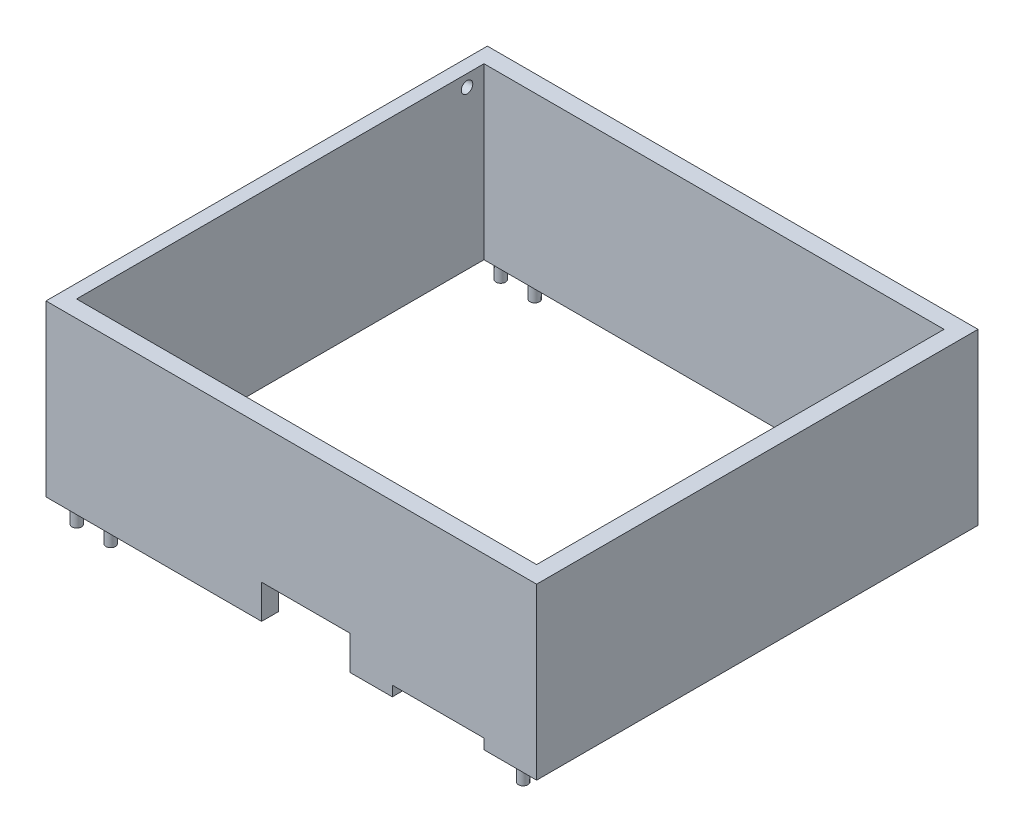
ISO-10303-21;
HEADER;
FILE_DESCRIPTION(('STEP AP214'),'2;1');
FILE_NAME('part.step','',(''),(''),'','','');
FILE_SCHEMA(('AUTOMOTIVE_DESIGN { 1 0 10303 214 1 1 1 1 }'));
ENDSEC;
DATA;
#1=APPLICATION_CONTEXT('core data for automotive mechanical design processes');
#2=APPLICATION_PROTOCOL_DEFINITION('international standard','automotive_design',2000,#1);
#3=PRODUCT_CONTEXT('',#1,'mechanical');
#4=PRODUCT('Part','Part','',(#3));
#5=PRODUCT_RELATED_PRODUCT_CATEGORY('part','',(#4));
#6=PRODUCT_DEFINITION_FORMATION('','',#4);
#7=PRODUCT_DEFINITION_CONTEXT('part definition',#1,'design');
#8=PRODUCT_DEFINITION('design','',#6,#7);
#9=PRODUCT_DEFINITION_SHAPE('','',#8);
#10=(LENGTH_UNIT() NAMED_UNIT(*) SI_UNIT(.MILLI.,.METRE.));
#11=(NAMED_UNIT(*) PLANE_ANGLE_UNIT() SI_UNIT($,.RADIAN.));
#12=(NAMED_UNIT(*) SI_UNIT($,.STERADIAN.) SOLID_ANGLE_UNIT());
#13=UNCERTAINTY_MEASURE_WITH_UNIT(LENGTH_MEASURE(1.E-05),#10,'distance_accuracy_value','');
#14=(GEOMETRIC_REPRESENTATION_CONTEXT(3) GLOBAL_UNCERTAINTY_ASSIGNED_CONTEXT((#13)) GLOBAL_UNIT_ASSIGNED_CONTEXT((#10,
#11,#12)) REPRESENTATION_CONTEXT('',''));
#15=CARTESIAN_POINT('',(0.,0.,0.));
#16=DIRECTION('',(0.,0.,1.));
#17=DIRECTION('',(1.,0.,0.));
#18=AXIS2_PLACEMENT_3D('',#15,#16,#17);
#19=CARTESIAN_POINT('',(0.,0.,0.));
#20=DIRECTION('',(0.,1.,0.));
#21=DIRECTION('',(0.,0.,1.));
#22=AXIS2_PLACEMENT_3D('',#19,#20,#21);
#23=PLANE('',#22);
#24=DIRECTION('',(1.,0.,0.));
#25=VECTOR('',#24,1.);
#26=CARTESIAN_POINT('',(72.25,0.,65.));
#27=LINE('',#26,#25);
#28=CARTESIAN_POINT('',(44.75,0.,65.));
#29=VERTEX_POINT('',#28);
#30=CARTESIAN_POINT('',(51.,0.,65.));
#31=VERTEX_POINT('',#30);
#32=EDGE_CURVE('E168',#29,#31,#27,.T.);
#33=ORIENTED_EDGE('',*,*,#32,.F.);
#34=DIRECTION('',(0.,0.,1.));
#35=VECTOR('',#34,1.);
#36=CARTESIAN_POINT('',(44.75,0.,48.5716117228159));
#37=LINE('',#36,#35);
#38=CARTESIAN_POINT('',(44.75,0.,62.5));
#39=VERTEX_POINT('',#38);
#40=EDGE_CURVE('E156',#39,#29,#37,.T.);
#41=ORIENTED_EDGE('',*,*,#40,.F.);
#42=DIRECTION('',(1.,0.,0.));
#43=VECTOR('',#42,1.);
#44=CARTESIAN_POINT('',(2.00000000000001,0.,62.5));
#45=LINE('',#44,#43);
#46=CARTESIAN_POINT('',(51.,0.,62.5));
#47=VERTEX_POINT('',#46);
#48=EDGE_CURVE('E166',#39,#47,#45,.T.);
#49=ORIENTED_EDGE('',*,*,#48,.T.);
#50=DIRECTION('',(0.,0.,1.));
#51=VECTOR('',#50,1.);
#52=CARTESIAN_POINT('',(51.,0.,48.5716117228159));
#53=LINE('',#52,#51);
#54=EDGE_CURVE('E54',#47,#31,#53,.T.);
#55=ORIENTED_EDGE('',*,*,#54,.T.);
#56=EDGE_LOOP('',(#33,#41,#49,#55));
#57=FACE_BOUND('',#56,.T.);
#58=ADVANCED_FACE('F39',(#57),#23,.F.);
#59=CARTESIAN_POINT('',(0.,25.,0.));
#60=DIRECTION('',(0.,1.,0.));
#61=DIRECTION('',(0.,0.,1.));
#62=AXIS2_PLACEMENT_3D('',#59,#60,#61);
#63=PLANE('',#62);
#64=DIRECTION('',(1.,0.,0.));
#65=VECTOR('',#64,1.);
#66=CARTESIAN_POINT('',(72.25,25.,65.));
#67=LINE('',#66,#65);
#68=CARTESIAN_POINT('',(0.,25.,65.));
#69=VERTEX_POINT('',#68);
#70=CARTESIAN_POINT('',(72.25,25.,65.));
#71=VERTEX_POINT('',#70);
#72=EDGE_CURVE('E203',#69,#71,#67,.T.);
#73=ORIENTED_EDGE('',*,*,#72,.T.);
#74=DIRECTION('',(0.,0.,-1.));
#75=VECTOR('',#74,1.);
#76=CARTESIAN_POINT('',(72.25,25.,0.));
#77=LINE('',#76,#75);
#78=CARTESIAN_POINT('',(72.25,25.,0.));
#79=VERTEX_POINT('',#78);
#80=EDGE_CURVE('E206',#71,#79,#77,.T.);
#81=ORIENTED_EDGE('',*,*,#80,.T.);
#82=DIRECTION('',(-1.,0.,0.));
#83=VECTOR('',#82,1.);
#84=CARTESIAN_POINT('',(0.,25.,0.));
#85=LINE('',#84,#83);
#86=CARTESIAN_POINT('',(0.,25.,0.));
#87=VERTEX_POINT('',#86);
#88=EDGE_CURVE('E209',#79,#87,#85,.T.);
#89=ORIENTED_EDGE('',*,*,#88,.T.);
#90=DIRECTION('',(0.,0.,1.));
#91=VECTOR('',#90,1.);
#92=CARTESIAN_POINT('',(0.,25.,0.));
#93=LINE('',#92,#91);
#94=EDGE_CURVE('E211',#87,#69,#93,.T.);
#95=ORIENTED_EDGE('',*,*,#94,.T.);
#96=EDGE_LOOP('',(#73,#81,#89,#95));
#97=FACE_BOUND('',#96,.T.);
#98=DIRECTION('',(0.,0.,-1.));
#99=VECTOR('',#98,1.);
#100=CARTESIAN_POINT('',(69.75,25.,2.5));
#101=LINE('',#100,#99);
#102=CARTESIAN_POINT('',(69.75,25.,62.5));
#103=VERTEX_POINT('',#102);
#104=CARTESIAN_POINT('',(69.75,25.,2.5));
#105=VERTEX_POINT('',#104);
#106=EDGE_CURVE('E280',#103,#105,#101,.T.);
#107=ORIENTED_EDGE('',*,*,#106,.F.);
#108=DIRECTION('',(1.,0.,0.));
#109=VECTOR('',#108,1.);
#110=CARTESIAN_POINT('',(2.00000000000001,25.,62.5));
#111=LINE('',#110,#109);
#112=CARTESIAN_POINT('',(2.00000000000001,25.,62.5));
#113=VERTEX_POINT('',#112);
#114=EDGE_CURVE('E191',#113,#103,#111,.T.);
#115=ORIENTED_EDGE('',*,*,#114,.F.);
#116=DIRECTION('',(0.,0.,1.));
#117=VECTOR('',#116,1.);
#118=CARTESIAN_POINT('',(2.,25.,2.5));
#119=LINE('',#118,#117);
#120=CARTESIAN_POINT('',(2.,25.,2.5));
#121=VERTEX_POINT('',#120);
#122=EDGE_CURVE('E181',#121,#113,#119,.T.);
#123=ORIENTED_EDGE('',*,*,#122,.F.);
#124=DIRECTION('',(-1.,0.,0.));
#125=VECTOR('',#124,1.);
#126=CARTESIAN_POINT('',(2.,25.,2.5));
#127=LINE('',#126,#125);
#128=EDGE_CURVE('E279',#105,#121,#127,.T.);
#129=ORIENTED_EDGE('',*,*,#128,.F.);
#130=EDGE_LOOP('',(#107,#115,#123,#129));
#131=FACE_BOUND('',#130,.T.);
#132=ADVANCED_FACE('F255',(#97,#131),#63,.T.);
#133=CARTESIAN_POINT('',(64.,0.,1.27793081581729));
#134=DIRECTION('',(0.,1.,0.));
#135=DIRECTION('',(0.,0.,1.));
#136=AXIS2_PLACEMENT_3D('',#133,#134,#135);
#137=CIRCLE('',#136,0.700000000000002);
#138=CARTESIAN_POINT('',(64.,0.,1.97793081581729));
#139=VERTEX_POINT('',#138);
#140=EDGE_CURVE('E11',#139,#139,#137,.F.);
#141=ORIENTED_EDGE('',*,*,#140,.F.);
#142=EDGE_LOOP('',(#141));
#143=FACE_BOUND('',#142,.T.);
#144=CARTESIAN_POINT('',(69.,0.,1.27793081581729));
#145=DIRECTION('',(0.,1.,0.));
#146=DIRECTION('',(0.,0.,1.));
#147=AXIS2_PLACEMENT_3D('',#144,#145,#146);
#148=CIRCLE('',#147,0.700000000000002);
#149=CARTESIAN_POINT('',(69.,0.,1.97793081581729));
#150=VERTEX_POINT('',#149);
#151=EDGE_CURVE('E47',#150,#150,#148,.F.);
#152=ORIENTED_EDGE('',*,*,#151,.F.);
#153=EDGE_LOOP('',(#152));
#154=FACE_BOUND('',#153,.T.);
#155=CARTESIAN_POINT('',(69.,0.,63.7220691841827));
#156=DIRECTION('',(0.,1.,0.));
#157=DIRECTION('',(0.,0.,1.));
#158=AXIS2_PLACEMENT_3D('',#155,#156,#157);
#159=CIRCLE('',#158,0.700000000000003);
#160=CARTESIAN_POINT('',(69.,0.,64.4220691841827));
#161=VERTEX_POINT('',#160);
#162=EDGE_CURVE('E245',#161,#161,#159,.F.);
#163=ORIENTED_EDGE('',*,*,#162,.F.);
#164=EDGE_LOOP('',(#163));
#165=FACE_BOUND('',#164,.T.);
#166=CARTESIAN_POINT('',(8.25000000000002,0.,1.27793081581729));
#167=DIRECTION('',(0.,1.,0.));
#168=DIRECTION('',(0.,0.,1.));
#169=AXIS2_PLACEMENT_3D('',#166,#167,#168);
#170=CIRCLE('',#169,0.7);
#171=CARTESIAN_POINT('',(8.25000000000002,0.,1.97793081581729));
#172=VERTEX_POINT('',#171);
#173=EDGE_CURVE('E242',#172,#172,#170,.F.);
#174=ORIENTED_EDGE('',*,*,#173,.F.);
#175=EDGE_LOOP('',(#174));
#176=FACE_BOUND('',#175,.T.);
#177=CARTESIAN_POINT('',(3.25000000000002,0.,1.27793081581729));
#178=DIRECTION('',(0.,1.,0.));
#179=DIRECTION('',(0.,0.,1.));
#180=AXIS2_PLACEMENT_3D('',#177,#178,#179);
#181=CIRCLE('',#180,0.7);
#182=CARTESIAN_POINT('',(3.25000000000002,0.,1.97793081581729));
#183=VERTEX_POINT('',#182);
#184=EDGE_CURVE('E239',#183,#183,#181,.F.);
#185=ORIENTED_EDGE('',*,*,#184,.F.);
#186=EDGE_LOOP('',(#185));
#187=FACE_BOUND('',#186,.T.);
#188=CARTESIAN_POINT('',(8.25000000000002,0.,63.7220691841827));
#189=DIRECTION('',(0.,1.,0.));
#190=DIRECTION('',(0.,0.,1.));
#191=AXIS2_PLACEMENT_3D('',#188,#189,#190);
#192=CIRCLE('',#191,0.700000000000001);
#193=CARTESIAN_POINT('',(8.25000000000002,0.,64.4220691841827));
#194=VERTEX_POINT('',#193);
#195=EDGE_CURVE('E236',#194,#194,#192,.F.);
#196=ORIENTED_EDGE('',*,*,#195,.F.);
#197=EDGE_LOOP('',(#196));
#198=FACE_BOUND('',#197,.T.);
#199=CARTESIAN_POINT('',(3.25000000000002,0.,63.7220691841827));
#200=DIRECTION('',(0.,1.,0.));
#201=DIRECTION('',(0.,0.,1.));
#202=AXIS2_PLACEMENT_3D('',#199,#200,#201);
#203=CIRCLE('',#202,0.700000000000001);
#204=CARTESIAN_POINT('',(3.25000000000002,0.,64.4220691841827));
#205=VERTEX_POINT('',#204);
#206=EDGE_CURVE('E233',#205,#205,#203,.F.);
#207=ORIENTED_EDGE('',*,*,#206,.F.);
#208=EDGE_LOOP('',(#207));
#209=FACE_BOUND('',#208,.T.);
#210=CARTESIAN_POINT('',(2.00000000000001,0.,62.5));
#211=VERTEX_POINT('',#210);
#212=CARTESIAN_POINT('',(31.75,0.,62.5));
#213=VERTEX_POINT('',#212);
#214=EDGE_CURVE('E174',#211,#213,#45,.T.);
#215=ORIENTED_EDGE('',*,*,#214,.T.);
#216=DIRECTION('',(0.,0.,1.));
#217=VECTOR('',#216,1.);
#218=CARTESIAN_POINT('',(31.75,0.,48.5716117228159));
#219=LINE('',#218,#217);
#220=CARTESIAN_POINT('',(31.75,0.,65.));
#221=VERTEX_POINT('',#220);
#222=EDGE_CURVE('E62',#213,#221,#219,.T.);
#223=ORIENTED_EDGE('',*,*,#222,.T.);
#224=CARTESIAN_POINT('',(0.,0.,65.));
#225=VERTEX_POINT('',#224);
#226=EDGE_CURVE('E214',#225,#221,#27,.T.);
#227=ORIENTED_EDGE('',*,*,#226,.F.);
#228=DIRECTION('',(0.,0.,1.));
#229=VECTOR('',#228,1.);
#230=CARTESIAN_POINT('',(0.,0.,0.));
#231=LINE('',#230,#229);
#232=CARTESIAN_POINT('',(0.,0.,0.));
#233=VERTEX_POINT('',#232);
#234=EDGE_CURVE('E207',#233,#225,#231,.T.);
#235=ORIENTED_EDGE('',*,*,#234,.F.);
#236=DIRECTION('',(-1.,0.,0.));
#237=VECTOR('',#236,1.);
#238=CARTESIAN_POINT('',(0.,0.,0.));
#239=LINE('',#238,#237);
#240=CARTESIAN_POINT('',(72.25,0.,0.));
#241=VERTEX_POINT('',#240);
#242=EDGE_CURVE('E219',#241,#233,#239,.T.);
#243=ORIENTED_EDGE('',*,*,#242,.F.);
#244=DIRECTION('',(0.,0.,-1.));
#245=VECTOR('',#244,1.);
#246=CARTESIAN_POINT('',(72.25,0.,0.));
#247=LINE('',#246,#245);
#248=CARTESIAN_POINT('',(72.25,0.,65.));
#249=VERTEX_POINT('',#248);
#250=EDGE_CURVE('E217',#249,#241,#247,.T.);
#251=ORIENTED_EDGE('',*,*,#250,.F.);
#252=CARTESIAN_POINT('',(64.5,0.,65.));
#253=VERTEX_POINT('',#252);
#254=EDGE_CURVE('E202',#253,#249,#27,.T.);
#255=ORIENTED_EDGE('',*,*,#254,.F.);
#256=DIRECTION('',(0.,0.,1.));
#257=VECTOR('',#256,1.);
#258=CARTESIAN_POINT('',(64.5,0.,48.5716117228159));
#259=LINE('',#258,#257);
#260=CARTESIAN_POINT('',(64.5,0.,62.5));
#261=VERTEX_POINT('',#260);
#262=EDGE_CURVE('E290',#261,#253,#259,.T.);
#263=ORIENTED_EDGE('',*,*,#262,.F.);
#264=CARTESIAN_POINT('',(69.75,0.,62.5));
#265=VERTEX_POINT('',#264);
#266=EDGE_CURVE('E175',#261,#265,#45,.T.);
#267=ORIENTED_EDGE('',*,*,#266,.T.);
#268=DIRECTION('',(0.,0.,-1.));
#269=VECTOR('',#268,1.);
#270=CARTESIAN_POINT('',(69.75,0.,2.5));
#271=LINE('',#270,#269);
#272=CARTESIAN_POINT('',(69.75,0.,2.5));
#273=VERTEX_POINT('',#272);
#274=EDGE_CURVE('E178',#265,#273,#271,.T.);
#275=ORIENTED_EDGE('',*,*,#274,.T.);
#276=DIRECTION('',(-1.,0.,0.));
#277=VECTOR('',#276,1.);
#278=CARTESIAN_POINT('',(2.,0.,2.5));
#279=LINE('',#278,#277);
#280=CARTESIAN_POINT('',(2.,0.,2.5));
#281=VERTEX_POINT('',#280);
#282=EDGE_CURVE('E185',#273,#281,#279,.T.);
#283=ORIENTED_EDGE('',*,*,#282,.T.);
#284=DIRECTION('',(0.,0.,1.));
#285=VECTOR('',#284,1.);
#286=CARTESIAN_POINT('',(2.,0.,2.5));
#287=LINE('',#286,#285);
#288=EDGE_CURVE('E188',#281,#211,#287,.T.);
#289=ORIENTED_EDGE('',*,*,#288,.T.);
#290=EDGE_LOOP('',(#215,#223,#227,#235,#243,#251,#255,#263,#267,#275,#283,#289));
#291=FACE_BOUND('',#290,.T.);
#292=ADVANCED_FACE('F252',(#143,#154,#165,#176,#187,#198,#209,#291),#23,.F.);
#293=CARTESIAN_POINT('',(72.25,25.,65.));
#294=DIRECTION('',(0.,0.,-1.));
#295=DIRECTION('',(-1.,0.,0.));
#296=AXIS2_PLACEMENT_3D('',#293,#294,#295);
#297=PLANE('',#296);
#298=DIRECTION('',(-1.,0.,0.));
#299=VECTOR('',#298,1.);
#300=CARTESIAN_POINT('',(31.75,5.,65.));
#301=LINE('',#300,#299);
#302=CARTESIAN_POINT('',(44.75,5.,65.));
#303=VERTEX_POINT('',#302);
#304=CARTESIAN_POINT('',(31.75,5.,65.));
#305=VERTEX_POINT('',#304);
#306=EDGE_CURVE('E169',#303,#305,#301,.T.);
#307=ORIENTED_EDGE('',*,*,#306,.F.);
#308=DIRECTION('',(0.,1.,0.));
#309=VECTOR('',#308,1.);
#310=CARTESIAN_POINT('',(44.75,0.,65.));
#311=LINE('',#310,#309);
#312=EDGE_CURVE('E317',#29,#303,#311,.T.);
#313=ORIENTED_EDGE('',*,*,#312,.F.);
#314=ORIENTED_EDGE('',*,*,#32,.T.);
#315=DIRECTION('',(0.,-1.,0.));
#316=VECTOR('',#315,1.);
#317=CARTESIAN_POINT('',(51.,0.,65.));
#318=LINE('',#317,#316);
#319=CARTESIAN_POINT('',(51.,1.5,65.));
#320=VERTEX_POINT('',#319);
#321=EDGE_CURVE('E293',#320,#31,#318,.T.);
#322=ORIENTED_EDGE('',*,*,#321,.F.);
#323=DIRECTION('',(-1.,0.,0.));
#324=VECTOR('',#323,1.);
#325=CARTESIAN_POINT('',(51.,1.5,65.));
#326=LINE('',#325,#324);
#327=CARTESIAN_POINT('',(64.5,1.5,65.));
#328=VERTEX_POINT('',#327);
#329=EDGE_CURVE('E286',#328,#320,#326,.T.);
#330=ORIENTED_EDGE('',*,*,#329,.F.);
#331=DIRECTION('',(0.,1.,0.));
#332=VECTOR('',#331,1.);
#333=CARTESIAN_POINT('',(64.5,0.,65.));
#334=LINE('',#333,#332);
#335=EDGE_CURVE('E289',#253,#328,#334,.T.);
#336=ORIENTED_EDGE('',*,*,#335,.F.);
#337=ORIENTED_EDGE('',*,*,#254,.T.);
#338=DIRECTION('',(0.,-1.,0.));
#339=VECTOR('',#338,1.);
#340=CARTESIAN_POINT('',(72.25,25.,65.));
#341=LINE('',#340,#339);
#342=EDGE_CURVE('E230',#71,#249,#341,.T.);
#343=ORIENTED_EDGE('',*,*,#342,.F.);
#344=ORIENTED_EDGE('',*,*,#72,.F.);
#345=DIRECTION('',(0.,-1.,0.));
#346=VECTOR('',#345,1.);
#347=CARTESIAN_POINT('',(0.,25.,65.));
#348=LINE('',#347,#346);
#349=EDGE_CURVE('E213',#69,#225,#348,.T.);
#350=ORIENTED_EDGE('',*,*,#349,.T.);
#351=ORIENTED_EDGE('',*,*,#226,.T.);
#352=DIRECTION('',(0.,-1.,0.));
#353=VECTOR('',#352,1.);
#354=CARTESIAN_POINT('',(31.75,0.,65.));
#355=LINE('',#354,#353);
#356=EDGE_CURVE('E295',#305,#221,#355,.T.);
#357=ORIENTED_EDGE('',*,*,#356,.F.);
#358=EDGE_LOOP('',(#307,#313,#314,#322,#330,#336,#337,#343,#344,#350,#351,#357));
#359=FACE_BOUND('',#358,.T.);
#360=ADVANCED_FACE('F41',(#359),#297,.F.);
#361=CARTESIAN_POINT('',(72.25,25.,0.));
#362=DIRECTION('',(-1.,0.,0.));
#363=DIRECTION('',(0.,0.,1.));
#364=AXIS2_PLACEMENT_3D('',#361,#362,#363);
#365=PLANE('',#364);
#366=ORIENTED_EDGE('',*,*,#250,.T.);
#367=DIRECTION('',(0.,-1.,0.));
#368=VECTOR('',#367,1.);
#369=CARTESIAN_POINT('',(72.25,25.,0.));
#370=LINE('',#369,#368);
#371=EDGE_CURVE('E227',#79,#241,#370,.T.);
#372=ORIENTED_EDGE('',*,*,#371,.F.);
#373=ORIENTED_EDGE('',*,*,#80,.F.);
#374=ORIENTED_EDGE('',*,*,#342,.T.);
#375=EDGE_LOOP('',(#366,#372,#373,#374));
#376=FACE_BOUND('',#375,.T.);
#377=ADVANCED_FACE('F393',(#376),#365,.F.);
#378=CARTESIAN_POINT('',(0.,25.,0.));
#379=DIRECTION('',(0.,0.,1.));
#380=DIRECTION('',(1.,0.,0.));
#381=AXIS2_PLACEMENT_3D('',#378,#379,#380);
#382=PLANE('',#381);
#383=ORIENTED_EDGE('',*,*,#242,.T.);
#384=DIRECTION('',(0.,-1.,0.));
#385=VECTOR('',#384,1.);
#386=CARTESIAN_POINT('',(0.,25.,0.));
#387=LINE('',#386,#385);
#388=EDGE_CURVE('E224',#87,#233,#387,.T.);
#389=ORIENTED_EDGE('',*,*,#388,.F.);
#390=ORIENTED_EDGE('',*,*,#88,.F.);
#391=ORIENTED_EDGE('',*,*,#371,.T.);
#392=EDGE_LOOP('',(#383,#389,#390,#391));
#393=FACE_BOUND('',#392,.T.);
#394=ADVANCED_FACE('F390',(#393),#382,.F.);
#395=CARTESIAN_POINT('',(0.,25.,0.));
#396=DIRECTION('',(1.,0.,0.));
#397=DIRECTION('',(0.,0.,-1.));
#398=AXIS2_PLACEMENT_3D('',#395,#396,#397);
#399=PLANE('',#398);
#400=ORIENTED_EDGE('',*,*,#234,.T.);
#401=ORIENTED_EDGE('',*,*,#349,.F.);
#402=ORIENTED_EDGE('',*,*,#94,.F.);
#403=ORIENTED_EDGE('',*,*,#388,.T.);
#404=EDGE_LOOP('',(#400,#401,#402,#403));
#405=FACE_BOUND('',#404,.T.);
#406=ADVANCED_FACE('F387',(#405),#399,.F.);
#407=CARTESIAN_POINT('',(2.00000000000001,25.,62.5));
#408=DIRECTION('',(0.,0.,-1.));
#409=DIRECTION('',(-1.,0.,0.));
#410=AXIS2_PLACEMENT_3D('',#407,#408,#409);
#411=PLANE('',#410);
#412=DIRECTION('',(0.,1.,0.));
#413=VECTOR('',#412,1.);
#414=CARTESIAN_POINT('',(44.75,0.,62.5));
#415=LINE('',#414,#413);
#416=CARTESIAN_POINT('',(44.75,5.,62.5));
#417=VERTEX_POINT('',#416);
#418=EDGE_CURVE('E152',#39,#417,#415,.T.);
#419=ORIENTED_EDGE('',*,*,#418,.T.);
#420=DIRECTION('',(-1.,0.,0.));
#421=VECTOR('',#420,1.);
#422=CARTESIAN_POINT('',(31.75,5.,62.5));
#423=LINE('',#422,#421);
#424=CARTESIAN_POINT('',(31.75,5.,62.5));
#425=VERTEX_POINT('',#424);
#426=EDGE_CURVE('E311',#417,#425,#423,.T.);
#427=ORIENTED_EDGE('',*,*,#426,.T.);
#428=DIRECTION('',(0.,-1.,0.));
#429=VECTOR('',#428,1.);
#430=CARTESIAN_POINT('',(31.75,0.,62.5));
#431=LINE('',#430,#429);
#432=EDGE_CURVE('E272',#425,#213,#431,.T.);
#433=ORIENTED_EDGE('',*,*,#432,.T.);
#434=ORIENTED_EDGE('',*,*,#214,.F.);
#435=DIRECTION('',(0.,-1.,0.));
#436=VECTOR('',#435,1.);
#437=CARTESIAN_POINT('',(2.00000000000001,25.,62.5));
#438=LINE('',#437,#436);
#439=EDGE_CURVE('E192',#113,#211,#438,.T.);
#440=ORIENTED_EDGE('',*,*,#439,.F.);
#441=ORIENTED_EDGE('',*,*,#114,.T.);
#442=DIRECTION('',(0.,-1.,0.));
#443=VECTOR('',#442,1.);
#444=CARTESIAN_POINT('',(69.75,25.,62.5));
#445=LINE('',#444,#443);
#446=EDGE_CURVE('E199',#103,#265,#445,.T.);
#447=ORIENTED_EDGE('',*,*,#446,.T.);
#448=ORIENTED_EDGE('',*,*,#266,.F.);
#449=DIRECTION('',(0.,1.,0.));
#450=VECTOR('',#449,1.);
#451=CARTESIAN_POINT('',(64.5,0.,62.5));
#452=LINE('',#451,#450);
#453=CARTESIAN_POINT('',(64.5,1.5,62.5));
#454=VERTEX_POINT('',#453);
#455=EDGE_CURVE('E301',#261,#454,#452,.T.);
#456=ORIENTED_EDGE('',*,*,#455,.T.);
#457=DIRECTION('',(-1.,0.,0.));
#458=VECTOR('',#457,1.);
#459=CARTESIAN_POINT('',(51.,1.5,62.5));
#460=LINE('',#459,#458);
#461=CARTESIAN_POINT('',(51.,1.5,62.5));
#462=VERTEX_POINT('',#461);
#463=EDGE_CURVE('E298',#454,#462,#460,.T.);
#464=ORIENTED_EDGE('',*,*,#463,.T.);
#465=DIRECTION('',(0.,-1.,0.));
#466=VECTOR('',#465,1.);
#467=CARTESIAN_POINT('',(51.,0.,62.5));
#468=LINE('',#467,#466);
#469=EDGE_CURVE('E173',#462,#47,#468,.T.);
#470=ORIENTED_EDGE('',*,*,#469,.T.);
#471=ORIENTED_EDGE('',*,*,#48,.F.);
#472=EDGE_LOOP('',(#419,#427,#433,#434,#440,#441,#447,#448,#456,#464,#470,#471));
#473=FACE_BOUND('',#472,.T.);
#474=ADVANCED_FACE('F171',(#473),#411,.T.);
#475=CARTESIAN_POINT('',(69.75,25.,2.5));
#476=DIRECTION('',(-1.,0.,0.));
#477=DIRECTION('',(0.,0.,1.));
#478=AXIS2_PLACEMENT_3D('',#475,#476,#477);
#479=PLANE('',#478);
#480=CARTESIAN_POINT('',(69.75,23.25,5.));
#481=DIRECTION('',(-1.,0.,0.));
#482=DIRECTION('',(0.,0.,1.));
#483=AXIS2_PLACEMENT_3D('',#480,#481,#482);
#484=CIRCLE('',#483,0.85);
#485=CARTESIAN_POINT('',(69.75,23.25,5.85));
#486=VERTEX_POINT('',#485);
#487=EDGE_CURVE('E342',#486,#486,#484,.T.);
#488=ORIENTED_EDGE('',*,*,#487,.F.);
#489=EDGE_LOOP('',(#488));
#490=FACE_BOUND('',#489,.T.);
#491=ORIENTED_EDGE('',*,*,#274,.F.);
#492=ORIENTED_EDGE('',*,*,#446,.F.);
#493=ORIENTED_EDGE('',*,*,#106,.T.);
#494=DIRECTION('',(0.,-1.,0.));
#495=VECTOR('',#494,1.);
#496=CARTESIAN_POINT('',(69.75,25.,2.5));
#497=LINE('',#496,#495);
#498=EDGE_CURVE('E197',#105,#273,#497,.T.);
#499=ORIENTED_EDGE('',*,*,#498,.T.);
#500=EDGE_LOOP('',(#491,#492,#493,#499));
#501=FACE_BOUND('',#500,.T.);
#502=ADVANCED_FACE('F375',(#490,#501),#479,.T.);
#503=CARTESIAN_POINT('',(2.,25.,2.5));
#504=DIRECTION('',(0.,0.,1.));
#505=DIRECTION('',(1.,0.,0.));
#506=AXIS2_PLACEMENT_3D('',#503,#504,#505);
#507=PLANE('',#506);
#508=ORIENTED_EDGE('',*,*,#282,.F.);
#509=ORIENTED_EDGE('',*,*,#498,.F.);
#510=ORIENTED_EDGE('',*,*,#128,.T.);
#511=DIRECTION('',(0.,-1.,0.));
#512=VECTOR('',#511,1.);
#513=CARTESIAN_POINT('',(2.,25.,2.5));
#514=LINE('',#513,#512);
#515=EDGE_CURVE('E195',#121,#281,#514,.T.);
#516=ORIENTED_EDGE('',*,*,#515,.T.);
#517=EDGE_LOOP('',(#508,#509,#510,#516));
#518=FACE_BOUND('',#517,.T.);
#519=ADVANCED_FACE('F365',(#518),#507,.T.);
#520=CARTESIAN_POINT('',(2.,25.,2.5));
#521=DIRECTION('',(1.,0.,0.));
#522=DIRECTION('',(0.,0.,-1.));
#523=AXIS2_PLACEMENT_3D('',#520,#521,#522);
#524=PLANE('',#523);
#525=CARTESIAN_POINT('',(2.,23.25,5.00000000000001));
#526=DIRECTION('',(1.,0.,0.));
#527=DIRECTION('',(0.,0.,-1.));
#528=AXIS2_PLACEMENT_3D('',#525,#526,#527);
#529=CIRCLE('',#528,0.85);
#530=CARTESIAN_POINT('',(2.,23.25,4.15000000000001));
#531=VERTEX_POINT('',#530);
#532=EDGE_CURVE('E348',#531,#531,#529,.T.);
#533=ORIENTED_EDGE('',*,*,#532,.F.);
#534=EDGE_LOOP('',(#533));
#535=FACE_BOUND('',#534,.T.);
#536=ORIENTED_EDGE('',*,*,#288,.F.);
#537=ORIENTED_EDGE('',*,*,#515,.F.);
#538=ORIENTED_EDGE('',*,*,#122,.T.);
#539=ORIENTED_EDGE('',*,*,#439,.T.);
#540=EDGE_LOOP('',(#536,#537,#538,#539));
#541=FACE_BOUND('',#540,.T.);
#542=ADVANCED_FACE('F274',(#535,#541),#524,.T.);
#543=CARTESIAN_POINT('',(64.5,0.,48.5716117228159));
#544=DIRECTION('',(1.,0.,0.));
#545=DIRECTION('',(0.,0.,-1.));
#546=AXIS2_PLACEMENT_3D('',#543,#544,#545);
#547=PLANE('',#546);
#548=ORIENTED_EDGE('',*,*,#262,.T.);
#549=ORIENTED_EDGE('',*,*,#335,.T.);
#550=DIRECTION('',(0.,0.,1.));
#551=VECTOR('',#550,1.);
#552=CARTESIAN_POINT('',(64.5,1.5,48.5716117228159));
#553=LINE('',#552,#551);
#554=EDGE_CURVE('E300',#454,#328,#553,.T.);
#555=ORIENTED_EDGE('',*,*,#554,.F.);
#556=ORIENTED_EDGE('',*,*,#455,.F.);
#557=EDGE_LOOP('',(#548,#549,#555,#556));
#558=FACE_BOUND('',#557,.T.);
#559=ADVANCED_FACE('F364',(#558),#547,.F.);
#560=CARTESIAN_POINT('',(51.,1.5,48.5716117228159));
#561=DIRECTION('',(0.,1.,0.));
#562=DIRECTION('',(-1.,0.,0.));
#563=AXIS2_PLACEMENT_3D('',#560,#561,#562);
#564=PLANE('',#563);
#565=ORIENTED_EDGE('',*,*,#554,.T.);
#566=ORIENTED_EDGE('',*,*,#329,.T.);
#567=DIRECTION('',(0.,0.,1.));
#568=VECTOR('',#567,1.);
#569=CARTESIAN_POINT('',(51.,1.5,48.5716117228159));
#570=LINE('',#569,#568);
#571=EDGE_CURVE('E297',#462,#320,#570,.T.);
#572=ORIENTED_EDGE('',*,*,#571,.F.);
#573=ORIENTED_EDGE('',*,*,#463,.F.);
#574=EDGE_LOOP('',(#565,#566,#572,#573));
#575=FACE_BOUND('',#574,.T.);
#576=ADVANCED_FACE('F371',(#575),#564,.F.);
#577=CARTESIAN_POINT('',(51.,0.,48.5716117228159));
#578=DIRECTION('',(-1.,0.,0.));
#579=DIRECTION('',(0.,-1.,0.));
#580=AXIS2_PLACEMENT_3D('',#577,#578,#579);
#581=PLANE('',#580);
#582=ORIENTED_EDGE('',*,*,#571,.T.);
#583=ORIENTED_EDGE('',*,*,#321,.T.);
#584=ORIENTED_EDGE('',*,*,#54,.F.);
#585=ORIENTED_EDGE('',*,*,#469,.F.);
#586=EDGE_LOOP('',(#582,#583,#584,#585));
#587=FACE_BOUND('',#586,.T.);
#588=ADVANCED_FACE('F442',(#587),#581,.F.);
#589=CARTESIAN_POINT('',(44.75,0.,48.5716117228159));
#590=DIRECTION('',(1.,0.,0.));
#591=DIRECTION('',(0.,0.,-1.));
#592=AXIS2_PLACEMENT_3D('',#589,#590,#591);
#593=PLANE('',#592);
#594=ORIENTED_EDGE('',*,*,#40,.T.);
#595=ORIENTED_EDGE('',*,*,#312,.T.);
#596=DIRECTION('',(0.,0.,1.));
#597=VECTOR('',#596,1.);
#598=CARTESIAN_POINT('',(44.75,5.,48.5716117228159));
#599=LINE('',#598,#597);
#600=EDGE_CURVE('E158',#417,#303,#599,.T.);
#601=ORIENTED_EDGE('',*,*,#600,.F.);
#602=ORIENTED_EDGE('',*,*,#418,.F.);
#603=EDGE_LOOP('',(#594,#595,#601,#602));
#604=FACE_BOUND('',#603,.T.);
#605=ADVANCED_FACE('F154',(#604),#593,.F.);
#606=CARTESIAN_POINT('',(31.75,5.,48.5716117228159));
#607=DIRECTION('',(0.,1.,0.));
#608=DIRECTION('',(-1.,0.,0.));
#609=AXIS2_PLACEMENT_3D('',#606,#607,#608);
#610=PLANE('',#609);
#611=ORIENTED_EDGE('',*,*,#600,.T.);
#612=ORIENTED_EDGE('',*,*,#306,.T.);
#613=DIRECTION('',(0.,0.,1.));
#614=VECTOR('',#613,1.);
#615=CARTESIAN_POINT('',(31.75,5.,48.5716117228159));
#616=LINE('',#615,#614);
#617=EDGE_CURVE('E312',#425,#305,#616,.T.);
#618=ORIENTED_EDGE('',*,*,#617,.F.);
#619=ORIENTED_EDGE('',*,*,#426,.F.);
#620=EDGE_LOOP('',(#611,#612,#618,#619));
#621=FACE_BOUND('',#620,.T.);
#622=ADVANCED_FACE('F426',(#621),#610,.F.);
#623=CARTESIAN_POINT('',(31.75,0.,48.5716117228159));
#624=DIRECTION('',(-1.,0.,0.));
#625=DIRECTION('',(0.,0.,1.));
#626=AXIS2_PLACEMENT_3D('',#623,#624,#625);
#627=PLANE('',#626);
#628=ORIENTED_EDGE('',*,*,#617,.T.);
#629=ORIENTED_EDGE('',*,*,#356,.T.);
#630=ORIENTED_EDGE('',*,*,#222,.F.);
#631=ORIENTED_EDGE('',*,*,#432,.F.);
#632=EDGE_LOOP('',(#628,#629,#630,#631));
#633=FACE_BOUND('',#632,.T.);
#634=ADVANCED_FACE('F427',(#633),#627,.F.);
#635=CARTESIAN_POINT('',(3.25000000000002,-2.5,63.7220691841827));
#636=DIRECTION('',(0.,1.,0.));
#637=DIRECTION('',(0.,0.,1.));
#638=AXIS2_PLACEMENT_3D('',#635,#636,#637);
#639=CYLINDRICAL_SURFACE('',#638,0.700000000000001);
#640=CARTESIAN_POINT('',(3.25000000000002,-2.5,63.7220691841827));
#641=DIRECTION('',(0.,-1.,0.));
#642=DIRECTION('',(0.,0.,-1.));
#643=AXIS2_PLACEMENT_3D('',#640,#641,#642);
#644=CIRCLE('',#643,0.700000000000001);
#645=CARTESIAN_POINT('',(3.25000000000002,-2.5,63.0220691841827));
#646=VERTEX_POINT('',#645);
#647=EDGE_CURVE('E308',#646,#646,#644,.T.);
#648=ORIENTED_EDGE('',*,*,#647,.F.);
#649=EDGE_LOOP('',(#648));
#650=FACE_BOUND('',#649,.T.);
#651=ORIENTED_EDGE('',*,*,#206,.T.);
#652=EDGE_LOOP('',(#651));
#653=FACE_BOUND('',#652,.T.);
#654=ADVANCED_FACE('F429',(#650,#653),#639,.T.);
#655=CARTESIAN_POINT('',(3.25000000000002,-2.5,63.7220691841827));
#656=DIRECTION('',(0.,-1.,0.));
#657=DIRECTION('',(0.,0.,-1.));
#658=AXIS2_PLACEMENT_3D('',#655,#656,#657);
#659=PLANE('',#658);
#660=ORIENTED_EDGE('',*,*,#647,.T.);
#661=EDGE_LOOP('',(#660));
#662=FACE_BOUND('',#661,.T.);
#663=ADVANCED_FACE('F435',(#662),#659,.T.);
#664=CARTESIAN_POINT('',(8.25000000000002,-2.5,63.7220691841827));
#665=DIRECTION('',(0.,1.,0.));
#666=DIRECTION('',(0.,0.,1.));
#667=AXIS2_PLACEMENT_3D('',#664,#665,#666);
#668=CYLINDRICAL_SURFACE('',#667,0.700000000000001);
#669=CARTESIAN_POINT('',(8.25000000000002,-2.5,63.7220691841827));
#670=DIRECTION('',(0.,-1.,0.));
#671=DIRECTION('',(0.,0.,-1.));
#672=AXIS2_PLACEMENT_3D('',#669,#670,#671);
#673=CIRCLE('',#672,0.700000000000001);
#674=CARTESIAN_POINT('',(8.25000000000002,-2.5,63.0220691841827));
#675=VERTEX_POINT('',#674);
#676=EDGE_CURVE('E323',#675,#675,#673,.T.);
#677=ORIENTED_EDGE('',*,*,#676,.F.);
#678=EDGE_LOOP('',(#677));
#679=FACE_BOUND('',#678,.T.);
#680=ORIENTED_EDGE('',*,*,#195,.T.);
#681=EDGE_LOOP('',(#680));
#682=FACE_BOUND('',#681,.T.);
#683=ADVANCED_FACE('F482',(#679,#682),#668,.T.);
#684=CARTESIAN_POINT('',(8.25000000000002,-2.5,63.7220691841827));
#685=DIRECTION('',(0.,-1.,0.));
#686=DIRECTION('',(0.,0.,-1.));
#687=AXIS2_PLACEMENT_3D('',#684,#685,#686);
#688=PLANE('',#687);
#689=ORIENTED_EDGE('',*,*,#676,.T.);
#690=EDGE_LOOP('',(#689));
#691=FACE_BOUND('',#690,.T.);
#692=ADVANCED_FACE('F491',(#691),#688,.T.);
#693=CARTESIAN_POINT('',(3.25000000000002,-2.5,1.27793081581729));
#694=DIRECTION('',(0.,1.,0.));
#695=DIRECTION('',(0.,0.,1.));
#696=AXIS2_PLACEMENT_3D('',#693,#694,#695);
#697=CYLINDRICAL_SURFACE('',#696,0.7);
#698=CARTESIAN_POINT('',(3.25000000000002,-2.5,1.27793081581729));
#699=DIRECTION('',(0.,-1.,0.));
#700=DIRECTION('',(0.,0.,1.));
#701=AXIS2_PLACEMENT_3D('',#698,#699,#700);
#702=CIRCLE('',#701,0.7);
#703=CARTESIAN_POINT('',(3.25000000000002,-2.5,1.97793081581729));
#704=VERTEX_POINT('',#703);
#705=EDGE_CURVE('E326',#704,#704,#702,.T.);
#706=ORIENTED_EDGE('',*,*,#705,.F.);
#707=EDGE_LOOP('',(#706));
#708=FACE_BOUND('',#707,.T.);
#709=ORIENTED_EDGE('',*,*,#184,.T.);
#710=EDGE_LOOP('',(#709));
#711=FACE_BOUND('',#710,.T.);
#712=ADVANCED_FACE('F501',(#708,#711),#697,.T.);
#713=CARTESIAN_POINT('',(3.25000000000002,-2.5,1.27793081581729));
#714=DIRECTION('',(0.,1.,0.));
#715=DIRECTION('',(0.,0.,1.));
#716=AXIS2_PLACEMENT_3D('',#713,#714,#715);
#717=PLANE('',#716);
#718=ORIENTED_EDGE('',*,*,#705,.T.);
#719=EDGE_LOOP('',(#718));
#720=FACE_BOUND('',#719,.T.);
#721=ADVANCED_FACE('F511',(#720),#717,.F.);
#722=CARTESIAN_POINT('',(8.25000000000002,-2.5,1.27793081581729));
#723=DIRECTION('',(0.,1.,0.));
#724=DIRECTION('',(0.,0.,1.));
#725=AXIS2_PLACEMENT_3D('',#722,#723,#724);
#726=CYLINDRICAL_SURFACE('',#725,0.7);
#727=CARTESIAN_POINT('',(8.25000000000002,-2.5,1.27793081581729));
#728=DIRECTION('',(0.,-1.,0.));
#729=DIRECTION('',(0.,0.,1.));
#730=AXIS2_PLACEMENT_3D('',#727,#728,#729);
#731=CIRCLE('',#730,0.7);
#732=CARTESIAN_POINT('',(8.25000000000002,-2.5,1.97793081581729));
#733=VERTEX_POINT('',#732);
#734=EDGE_CURVE('E329',#733,#733,#731,.T.);
#735=ORIENTED_EDGE('',*,*,#734,.F.);
#736=EDGE_LOOP('',(#735));
#737=FACE_BOUND('',#736,.T.);
#738=ORIENTED_EDGE('',*,*,#173,.T.);
#739=EDGE_LOOP('',(#738));
#740=FACE_BOUND('',#739,.T.);
#741=ADVANCED_FACE('F521',(#737,#740),#726,.T.);
#742=CARTESIAN_POINT('',(8.25000000000002,-2.5,1.27793081581729));
#743=DIRECTION('',(0.,1.,0.));
#744=DIRECTION('',(0.,0.,1.));
#745=AXIS2_PLACEMENT_3D('',#742,#743,#744);
#746=PLANE('',#745);
#747=ORIENTED_EDGE('',*,*,#734,.T.);
#748=EDGE_LOOP('',(#747));
#749=FACE_BOUND('',#748,.T.);
#750=ADVANCED_FACE('F531',(#749),#746,.F.);
#751=CARTESIAN_POINT('',(69.,-2.5,63.7220691841827));
#752=DIRECTION('',(0.,1.,0.));
#753=DIRECTION('',(0.,0.,1.));
#754=AXIS2_PLACEMENT_3D('',#751,#752,#753);
#755=CYLINDRICAL_SURFACE('',#754,0.700000000000003);
#756=CARTESIAN_POINT('',(69.,-2.5,63.7220691841827));
#757=DIRECTION('',(0.,-1.,0.));
#758=DIRECTION('',(0.,0.,1.));
#759=AXIS2_PLACEMENT_3D('',#756,#757,#758);
#760=CIRCLE('',#759,0.700000000000003);
#761=CARTESIAN_POINT('',(69.,-2.5,64.4220691841827));
#762=VERTEX_POINT('',#761);
#763=EDGE_CURVE('E332',#762,#762,#760,.T.);
#764=ORIENTED_EDGE('',*,*,#763,.F.);
#765=EDGE_LOOP('',(#764));
#766=FACE_BOUND('',#765,.T.);
#767=ORIENTED_EDGE('',*,*,#162,.T.);
#768=EDGE_LOOP('',(#767));
#769=FACE_BOUND('',#768,.T.);
#770=ADVANCED_FACE('F541',(#766,#769),#755,.T.);
#771=CARTESIAN_POINT('',(69.,-2.5,63.7220691841827));
#772=DIRECTION('',(0.,1.,0.));
#773=DIRECTION('',(0.,0.,1.));
#774=AXIS2_PLACEMENT_3D('',#771,#772,#773);
#775=PLANE('',#774);
#776=ORIENTED_EDGE('',*,*,#763,.T.);
#777=EDGE_LOOP('',(#776));
#778=FACE_BOUND('',#777,.T.);
#779=ADVANCED_FACE('F551',(#778),#775,.F.);
#780=CARTESIAN_POINT('',(69.,-2.5,1.27793081581729));
#781=DIRECTION('',(0.,1.,0.));
#782=DIRECTION('',(0.,0.,1.));
#783=AXIS2_PLACEMENT_3D('',#780,#781,#782);
#784=CYLINDRICAL_SURFACE('',#783,0.700000000000002);
#785=CARTESIAN_POINT('',(69.,-2.5,1.27793081581729));
#786=DIRECTION('',(0.,-1.,0.));
#787=DIRECTION('',(0.,0.,-1.));
#788=AXIS2_PLACEMENT_3D('',#785,#786,#787);
#789=CIRCLE('',#788,0.700000000000002);
#790=CARTESIAN_POINT('',(69.,-2.5,0.577930815817283));
#791=VERTEX_POINT('',#790);
#792=EDGE_CURVE('E335',#791,#791,#789,.T.);
#793=ORIENTED_EDGE('',*,*,#792,.F.);
#794=EDGE_LOOP('',(#793));
#795=FACE_BOUND('',#794,.T.);
#796=ORIENTED_EDGE('',*,*,#151,.T.);
#797=EDGE_LOOP('',(#796));
#798=FACE_BOUND('',#797,.T.);
#799=ADVANCED_FACE('F250',(#795,#798),#784,.T.);
#800=CARTESIAN_POINT('',(69.,-2.5,1.27793081581729));
#801=DIRECTION('',(0.,-1.,0.));
#802=DIRECTION('',(0.,0.,-1.));
#803=AXIS2_PLACEMENT_3D('',#800,#801,#802);
#804=PLANE('',#803);
#805=ORIENTED_EDGE('',*,*,#792,.T.);
#806=EDGE_LOOP('',(#805));
#807=FACE_BOUND('',#806,.T.);
#808=ADVANCED_FACE('F570',(#807),#804,.T.);
#809=CARTESIAN_POINT('',(64.,-2.5,1.27793081581729));
#810=DIRECTION('',(0.,1.,0.));
#811=DIRECTION('',(0.,0.,1.));
#812=AXIS2_PLACEMENT_3D('',#809,#810,#811);
#813=CYLINDRICAL_SURFACE('',#812,0.700000000000002);
#814=CARTESIAN_POINT('',(64.,-2.5,1.27793081581729));
#815=DIRECTION('',(0.,-1.,0.));
#816=DIRECTION('',(0.,0.,-1.));
#817=AXIS2_PLACEMENT_3D('',#814,#815,#816);
#818=CIRCLE('',#817,0.700000000000002);
#819=CARTESIAN_POINT('',(64.,-2.5,0.577930815817283));
#820=VERTEX_POINT('',#819);
#821=EDGE_CURVE('E338',#820,#820,#818,.T.);
#822=ORIENTED_EDGE('',*,*,#821,.F.);
#823=EDGE_LOOP('',(#822));
#824=FACE_BOUND('',#823,.T.);
#825=ORIENTED_EDGE('',*,*,#140,.T.);
#826=EDGE_LOOP('',(#825));
#827=FACE_BOUND('',#826,.T.);
#828=ADVANCED_FACE('F580',(#824,#827),#813,.T.);
#829=CARTESIAN_POINT('',(64.,-2.5,1.27793081581729));
#830=DIRECTION('',(0.,-1.,0.));
#831=DIRECTION('',(0.,0.,-1.));
#832=AXIS2_PLACEMENT_3D('',#829,#830,#831);
#833=PLANE('',#832);
#834=ORIENTED_EDGE('',*,*,#821,.T.);
#835=EDGE_LOOP('',(#834));
#836=FACE_BOUND('',#835,.T.);
#837=ADVANCED_FACE('F590',(#836),#833,.T.);
#838=CARTESIAN_POINT('',(71.,23.25,5.));
#839=DIRECTION('',(-1.,0.,0.));
#840=DIRECTION('',(0.,0.,1.));
#841=AXIS2_PLACEMENT_3D('',#838,#839,#840);
#842=CYLINDRICAL_SURFACE('',#841,0.85);
#843=CARTESIAN_POINT('',(71.,23.25,5.));
#844=DIRECTION('',(-1.,0.,0.));
#845=DIRECTION('',(0.,0.,1.));
#846=AXIS2_PLACEMENT_3D('',#843,#844,#845);
#847=CIRCLE('',#846,0.85);
#848=CARTESIAN_POINT('',(71.,23.25,5.85));
#849=VERTEX_POINT('',#848);
#850=EDGE_CURVE('E341',#849,#849,#847,.T.);
#851=ORIENTED_EDGE('',*,*,#850,.F.);
#852=EDGE_LOOP('',(#851));
#853=FACE_BOUND('',#852,.T.);
#854=ORIENTED_EDGE('',*,*,#487,.T.);
#855=EDGE_LOOP('',(#854));
#856=FACE_BOUND('',#855,.T.);
#857=ADVANCED_FACE('F600',(#853,#856),#842,.F.);
#858=CARTESIAN_POINT('',(71.,23.25,5.));
#859=DIRECTION('',(-1.,0.,0.));
#860=DIRECTION('',(0.,0.,1.));
#861=AXIS2_PLACEMENT_3D('',#858,#859,#860);
#862=PLANE('',#861);
#863=ORIENTED_EDGE('',*,*,#850,.T.);
#864=EDGE_LOOP('',(#863));
#865=FACE_BOUND('',#864,.T.);
#866=ADVANCED_FACE('F359',(#865),#862,.T.);
#867=CARTESIAN_POINT('',(0.750000000000002,23.25,5.00000000000001));
#868=DIRECTION('',(1.,0.,0.));
#869=DIRECTION('',(0.,0.,-1.));
#870=AXIS2_PLACEMENT_3D('',#867,#868,#869);
#871=CYLINDRICAL_SURFACE('',#870,0.85);
#872=CARTESIAN_POINT('',(0.750000000000002,23.25,5.00000000000001));
#873=DIRECTION('',(1.,0.,0.));
#874=DIRECTION('',(0.,0.,-1.));
#875=AXIS2_PLACEMENT_3D('',#872,#873,#874);
#876=CIRCLE('',#875,0.85);
#877=CARTESIAN_POINT('',(0.750000000000002,23.25,4.15000000000001));
#878=VERTEX_POINT('',#877);
#879=EDGE_CURVE('E345',#878,#878,#876,.T.);
#880=ORIENTED_EDGE('',*,*,#879,.F.);
#881=EDGE_LOOP('',(#880));
#882=FACE_BOUND('',#881,.T.);
#883=ORIENTED_EDGE('',*,*,#532,.T.);
#884=EDGE_LOOP('',(#883));
#885=FACE_BOUND('',#884,.T.);
#886=ADVANCED_FACE('F356',(#882,#885),#871,.F.);
#887=CARTESIAN_POINT('',(0.750000000000002,23.25,5.00000000000001));
#888=DIRECTION('',(1.,0.,0.));
#889=DIRECTION('',(0.,0.,-1.));
#890=AXIS2_PLACEMENT_3D('',#887,#888,#889);
#891=PLANE('',#890);
#892=ORIENTED_EDGE('',*,*,#879,.T.);
#893=EDGE_LOOP('',(#892));
#894=FACE_BOUND('',#893,.T.);
#895=ADVANCED_FACE('F354',(#894),#891,.T.);
#896=CLOSED_SHELL('',(#58,#132,#292,#360,#377,#394,#406,#474,#502,#519,#542,#559,#576,#588,#605,
#622,#634,#654,#663,#683,#692,#712,#721,#741,#750,#770,#779,#799,#808,#828,#837,#857,#866,#886,#895));
#897=MANIFOLD_SOLID_BREP('B2',#896);
#898=ADVANCED_BREP_SHAPE_REPRESENTATION('',(#18,#897),#14);
#899=SHAPE_DEFINITION_REPRESENTATION(#9,#898);
ENDSEC;
END-ISO-10303-21;
